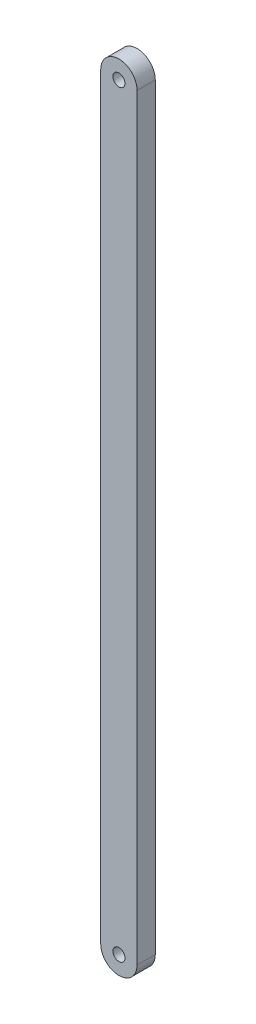
ISO-10303-21;
HEADER;
FILE_DESCRIPTION(('STEP AP214'),'2;1');
FILE_NAME('part.step','',(''),(''),'','','');
FILE_SCHEMA(('AUTOMOTIVE_DESIGN { 1 0 10303 214 1 1 1 1 }'));
ENDSEC;
DATA;
#1=APPLICATION_CONTEXT('core data for automotive mechanical design processes');
#2=APPLICATION_PROTOCOL_DEFINITION('international standard','automotive_design',2000,#1);
#3=PRODUCT_CONTEXT('',#1,'mechanical');
#4=PRODUCT('Part','Part','',(#3));
#5=PRODUCT_RELATED_PRODUCT_CATEGORY('part','',(#4));
#6=PRODUCT_DEFINITION_FORMATION('','',#4);
#7=PRODUCT_DEFINITION_CONTEXT('part definition',#1,'design');
#8=PRODUCT_DEFINITION('design','',#6,#7);
#9=PRODUCT_DEFINITION_SHAPE('','',#8);
#10=(LENGTH_UNIT() NAMED_UNIT(*) SI_UNIT(.MILLI.,.METRE.));
#11=(NAMED_UNIT(*) PLANE_ANGLE_UNIT() SI_UNIT($,.RADIAN.));
#12=(NAMED_UNIT(*) SI_UNIT($,.STERADIAN.) SOLID_ANGLE_UNIT());
#13=UNCERTAINTY_MEASURE_WITH_UNIT(LENGTH_MEASURE(1.E-05),#10,'distance_accuracy_value','');
#14=(GEOMETRIC_REPRESENTATION_CONTEXT(3) GLOBAL_UNCERTAINTY_ASSIGNED_CONTEXT((#13)) GLOBAL_UNIT_ASSIGNED_CONTEXT((#10,
#11,#12)) REPRESENTATION_CONTEXT('',''));
#15=CARTESIAN_POINT('',(0.,0.,0.));
#16=DIRECTION('',(0.,0.,1.));
#17=DIRECTION('',(1.,0.,0.));
#18=AXIS2_PLACEMENT_3D('',#15,#16,#17);
#19=CARTESIAN_POINT('',(0.,0.,3.));
#20=DIRECTION('',(0.,0.,-1.));
#21=DIRECTION('',(-1.,0.,0.));
#22=AXIS2_PLACEMENT_3D('',#19,#20,#21);
#23=CYLINDRICAL_SURFACE('',#22,3.);
#24=CARTESIAN_POINT('',(0.,0.,0.));
#25=DIRECTION('',(0.,0.,1.));
#26=DIRECTION('',(1.,0.,0.));
#27=AXIS2_PLACEMENT_3D('',#24,#25,#26);
#28=CIRCLE('',#27,3.);
#29=CARTESIAN_POINT('',(-2.99999999999999,0.,0.));
#30=VERTEX_POINT('',#29);
#31=CARTESIAN_POINT('',(3.00000000000002,0.,0.));
#32=VERTEX_POINT('',#31);
#33=EDGE_CURVE('E96',#30,#32,#28,.T.);
#34=ORIENTED_EDGE('',*,*,#33,.T.);
#35=DIRECTION('',(0.,0.,-1.));
#36=VECTOR('',#35,1.);
#37=CARTESIAN_POINT('',(3.00000000000002,0.,3.));
#38=LINE('',#37,#36);
#39=CARTESIAN_POINT('',(3.00000000000002,0.,3.));
#40=VERTEX_POINT('',#39);
#41=EDGE_CURVE('E11',#40,#32,#38,.T.);
#42=ORIENTED_EDGE('',*,*,#41,.F.);
#43=CARTESIAN_POINT('',(0.,0.,3.));
#44=DIRECTION('',(0.,0.,1.));
#45=DIRECTION('',(1.,0.,0.));
#46=AXIS2_PLACEMENT_3D('',#43,#44,#45);
#47=CIRCLE('',#46,3.);
#48=CARTESIAN_POINT('',(-2.99999999999999,0.,3.));
#49=VERTEX_POINT('',#48);
#50=EDGE_CURVE('E84',#49,#40,#47,.T.);
#51=ORIENTED_EDGE('',*,*,#50,.F.);
#52=DIRECTION('',(0.,0.,-1.));
#53=VECTOR('',#52,1.);
#54=CARTESIAN_POINT('',(-2.99999999999999,0.,3.));
#55=LINE('',#54,#53);
#56=EDGE_CURVE('E92',#49,#30,#55,.T.);
#57=ORIENTED_EDGE('',*,*,#56,.T.);
#58=EDGE_LOOP('',(#34,#42,#51,#57));
#59=FACE_BOUND('',#58,.T.);
#60=ADVANCED_FACE('F33',(#59),#23,.T.);
#61=CARTESIAN_POINT('',(3.00000000000002,0.,3.));
#62=DIRECTION('',(-1.,0.,0.));
#63=DIRECTION('',(0.,0.,1.));
#64=AXIS2_PLACEMENT_3D('',#61,#62,#63);
#65=PLANE('',#64);
#66=DIRECTION('',(0.,1.,0.));
#67=VECTOR('',#66,1.);
#68=CARTESIAN_POINT('',(3.00000000000002,0.,0.));
#69=LINE('',#68,#67);
#70=CARTESIAN_POINT('',(3.00000000000002,125.,0.));
#71=VERTEX_POINT('',#70);
#72=EDGE_CURVE('E88',#32,#71,#69,.T.);
#73=ORIENTED_EDGE('',*,*,#72,.T.);
#74=DIRECTION('',(0.,0.,-1.));
#75=VECTOR('',#74,1.);
#76=CARTESIAN_POINT('',(3.00000000000002,125.,3.));
#77=LINE('',#76,#75);
#78=CARTESIAN_POINT('',(3.00000000000002,125.,3.));
#79=VERTEX_POINT('',#78);
#80=EDGE_CURVE('E41',#79,#71,#77,.T.);
#81=ORIENTED_EDGE('',*,*,#80,.F.);
#82=DIRECTION('',(0.,1.,0.));
#83=VECTOR('',#82,1.);
#84=CARTESIAN_POINT('',(3.00000000000002,0.,3.));
#85=LINE('',#84,#83);
#86=EDGE_CURVE('E79',#40,#79,#85,.T.);
#87=ORIENTED_EDGE('',*,*,#86,.F.);
#88=ORIENTED_EDGE('',*,*,#41,.T.);
#89=EDGE_LOOP('',(#73,#81,#87,#88));
#90=FACE_BOUND('',#89,.T.);
#91=ADVANCED_FACE('F87',(#90),#65,.F.);
#92=CARTESIAN_POINT('',(0.,125.,3.));
#93=DIRECTION('',(0.,0.,-1.));
#94=DIRECTION('',(-1.,0.,0.));
#95=AXIS2_PLACEMENT_3D('',#92,#93,#94);
#96=CYLINDRICAL_SURFACE('',#95,3.00000000000001);
#97=CARTESIAN_POINT('',(0.,125.,0.));
#98=DIRECTION('',(0.,0.,1.));
#99=DIRECTION('',(1.,0.,0.));
#100=AXIS2_PLACEMENT_3D('',#97,#98,#99);
#101=CIRCLE('',#100,3.00000000000001);
#102=CARTESIAN_POINT('',(-3.00000000000001,125.,0.));
#103=VERTEX_POINT('',#102);
#104=EDGE_CURVE('E66',#71,#103,#101,.T.);
#105=ORIENTED_EDGE('',*,*,#104,.T.);
#106=DIRECTION('',(0.,0.,-1.));
#107=VECTOR('',#106,1.);
#108=CARTESIAN_POINT('',(-3.00000000000001,125.,3.));
#109=LINE('',#108,#107);
#110=CARTESIAN_POINT('',(-3.00000000000001,125.,3.));
#111=VERTEX_POINT('',#110);
#112=EDGE_CURVE('E89',#111,#103,#109,.T.);
#113=ORIENTED_EDGE('',*,*,#112,.F.);
#114=CARTESIAN_POINT('',(0.,125.,3.));
#115=DIRECTION('',(0.,0.,1.));
#116=DIRECTION('',(1.,0.,0.));
#117=AXIS2_PLACEMENT_3D('',#114,#115,#116);
#118=CIRCLE('',#117,3.00000000000001);
#119=EDGE_CURVE('E82',#79,#111,#118,.T.);
#120=ORIENTED_EDGE('',*,*,#119,.F.);
#121=ORIENTED_EDGE('',*,*,#80,.T.);
#122=EDGE_LOOP('',(#105,#113,#120,#121));
#123=FACE_BOUND('',#122,.T.);
#124=ADVANCED_FACE('F90',(#123),#96,.T.);
#125=CARTESIAN_POINT('',(-3.,125.,3.));
#126=DIRECTION('',(1.,0.,0.));
#127=DIRECTION('',(0.,1.,0.));
#128=AXIS2_PLACEMENT_3D('',#125,#126,#127);
#129=PLANE('',#128);
#130=DIRECTION('',(0.,-1.,0.));
#131=VECTOR('',#130,1.);
#132=CARTESIAN_POINT('',(-3.,125.,0.));
#133=LINE('',#132,#131);
#134=EDGE_CURVE('E72',#103,#30,#133,.T.);
#135=ORIENTED_EDGE('',*,*,#134,.T.);
#136=ORIENTED_EDGE('',*,*,#56,.F.);
#137=DIRECTION('',(0.,-1.,0.));
#138=VECTOR('',#137,1.);
#139=CARTESIAN_POINT('',(-3.,125.,3.));
#140=LINE('',#139,#138);
#141=EDGE_CURVE('E49',#111,#49,#140,.T.);
#142=ORIENTED_EDGE('',*,*,#141,.F.);
#143=ORIENTED_EDGE('',*,*,#112,.T.);
#144=EDGE_LOOP('',(#135,#136,#142,#143));
#145=FACE_BOUND('',#144,.T.);
#146=ADVANCED_FACE('F104',(#145),#129,.F.);
#147=CARTESIAN_POINT('',(0.,0.,3.));
#148=DIRECTION('',(0.,0.,1.));
#149=DIRECTION('',(1.,0.,0.));
#150=AXIS2_PLACEMENT_3D('',#147,#148,#149);
#151=PLANE('',#150);
#152=CARTESIAN_POINT('',(0.,125.,3.));
#153=DIRECTION('',(0.,0.,1.));
#154=DIRECTION('',(1.,0.,0.));
#155=AXIS2_PLACEMENT_3D('',#152,#153,#154);
#156=CIRCLE('',#155,0.999999999999996);
#157=CARTESIAN_POINT('',(0.999999999999996,125.,3.));
#158=VERTEX_POINT('',#157);
#159=EDGE_CURVE('E116',#158,#158,#156,.T.);
#160=ORIENTED_EDGE('',*,*,#159,.F.);
#161=EDGE_LOOP('',(#160));
#162=FACE_BOUND('',#161,.T.);
#163=CARTESIAN_POINT('',(0.,0.,3.));
#164=DIRECTION('',(0.,0.,1.));
#165=DIRECTION('',(1.,0.,0.));
#166=AXIS2_PLACEMENT_3D('',#163,#164,#165);
#167=CIRCLE('',#166,1.);
#168=CARTESIAN_POINT('',(1.,0.,3.));
#169=VERTEX_POINT('',#168);
#170=EDGE_CURVE('E110',#169,#169,#167,.T.);
#171=ORIENTED_EDGE('',*,*,#170,.F.);
#172=EDGE_LOOP('',(#171));
#173=FACE_BOUND('',#172,.T.);
#174=ORIENTED_EDGE('',*,*,#50,.T.);
#175=ORIENTED_EDGE('',*,*,#86,.T.);
#176=ORIENTED_EDGE('',*,*,#119,.T.);
#177=ORIENTED_EDGE('',*,*,#141,.T.);
#178=EDGE_LOOP('',(#174,#175,#176,#177));
#179=FACE_BOUND('',#178,.T.);
#180=ADVANCED_FACE('F80',(#162,#173,#179),#151,.T.);
#181=CARTESIAN_POINT('',(0.,0.,0.));
#182=DIRECTION('',(0.,0.,1.));
#183=DIRECTION('',(1.,0.,0.));
#184=AXIS2_PLACEMENT_3D('',#181,#182,#183);
#185=PLANE('',#184);
#186=CARTESIAN_POINT('',(0.,125.,0.));
#187=DIRECTION('',(0.,0.,1.));
#188=DIRECTION('',(1.,0.,0.));
#189=AXIS2_PLACEMENT_3D('',#186,#187,#188);
#190=CIRCLE('',#189,0.999999999999996);
#191=CARTESIAN_POINT('',(0.999999999999996,125.,0.));
#192=VERTEX_POINT('',#191);
#193=EDGE_CURVE('E99',#192,#192,#190,.T.);
#194=ORIENTED_EDGE('',*,*,#193,.T.);
#195=EDGE_LOOP('',(#194));
#196=FACE_BOUND('',#195,.T.);
#197=CARTESIAN_POINT('',(0.,0.,0.));
#198=DIRECTION('',(0.,0.,1.));
#199=DIRECTION('',(1.,0.,0.));
#200=AXIS2_PLACEMENT_3D('',#197,#198,#199);
#201=CIRCLE('',#200,1.);
#202=CARTESIAN_POINT('',(1.,0.,0.));
#203=VERTEX_POINT('',#202);
#204=EDGE_CURVE('E113',#203,#203,#201,.T.);
#205=ORIENTED_EDGE('',*,*,#204,.T.);
#206=EDGE_LOOP('',(#205));
#207=FACE_BOUND('',#206,.T.);
#208=ORIENTED_EDGE('',*,*,#33,.F.);
#209=ORIENTED_EDGE('',*,*,#134,.F.);
#210=ORIENTED_EDGE('',*,*,#104,.F.);
#211=ORIENTED_EDGE('',*,*,#72,.F.);
#212=EDGE_LOOP('',(#208,#209,#210,#211));
#213=FACE_BOUND('',#212,.T.);
#214=ADVANCED_FACE('F107',(#196,#207,#213),#185,.F.);
#215=CARTESIAN_POINT('',(0.,0.,0.));
#216=DIRECTION('',(0.,0.,1.));
#217=DIRECTION('',(1.,0.,0.));
#218=AXIS2_PLACEMENT_3D('',#215,#216,#217);
#219=CYLINDRICAL_SURFACE('',#218,1.);
#220=ORIENTED_EDGE('',*,*,#204,.F.);
#221=EDGE_LOOP('',(#220));
#222=FACE_BOUND('',#221,.T.);
#223=ORIENTED_EDGE('',*,*,#170,.T.);
#224=EDGE_LOOP('',(#223));
#225=FACE_BOUND('',#224,.T.);
#226=ADVANCED_FACE('F127',(#222,#225),#219,.F.);
#227=CARTESIAN_POINT('',(0.,125.,0.));
#228=DIRECTION('',(0.,0.,1.));
#229=DIRECTION('',(1.,0.,0.));
#230=AXIS2_PLACEMENT_3D('',#227,#228,#229);
#231=CYLINDRICAL_SURFACE('',#230,0.999999999999996);
#232=ORIENTED_EDGE('',*,*,#193,.F.);
#233=EDGE_LOOP('',(#232));
#234=FACE_BOUND('',#233,.T.);
#235=ORIENTED_EDGE('',*,*,#159,.T.);
#236=EDGE_LOOP('',(#235));
#237=FACE_BOUND('',#236,.T.);
#238=ADVANCED_FACE('F124',(#234,#237),#231,.F.);
#239=CLOSED_SHELL('',(#60,#91,#124,#146,#180,#214,#226,#238));
#240=MANIFOLD_SOLID_BREP('B2',#239);
#241=ADVANCED_BREP_SHAPE_REPRESENTATION('',(#18,#240),#14);
#242=SHAPE_DEFINITION_REPRESENTATION(#9,#241);
ENDSEC;
END-ISO-10303-21;
